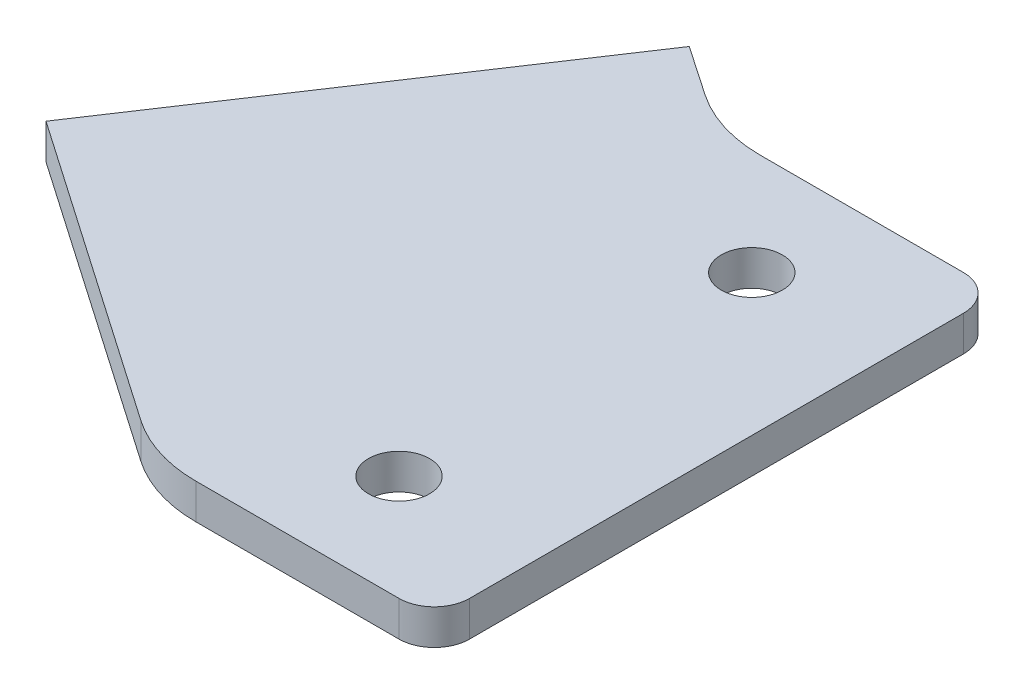
ISO-10303-21;
HEADER;
FILE_DESCRIPTION(('STEP AP214'),'2;1');
FILE_NAME('part.step','',(''),(''),'','','');
FILE_SCHEMA(('AUTOMOTIVE_DESIGN { 1 0 10303 214 1 1 1 1 }'));
ENDSEC;
DATA;
#1=APPLICATION_CONTEXT('core data for automotive mechanical design processes');
#2=APPLICATION_PROTOCOL_DEFINITION('international standard','automotive_design',2000,#1);
#3=PRODUCT_CONTEXT('',#1,'mechanical');
#4=PRODUCT('Part','Part','',(#3));
#5=PRODUCT_RELATED_PRODUCT_CATEGORY('part','',(#4));
#6=PRODUCT_DEFINITION_FORMATION('','',#4);
#7=PRODUCT_DEFINITION_CONTEXT('part definition',#1,'design');
#8=PRODUCT_DEFINITION('design','',#6,#7);
#9=PRODUCT_DEFINITION_SHAPE('','',#8);
#10=(LENGTH_UNIT() NAMED_UNIT(*) SI_UNIT(.MILLI.,.METRE.));
#11=(NAMED_UNIT(*) PLANE_ANGLE_UNIT() SI_UNIT($,.RADIAN.));
#12=(NAMED_UNIT(*) SI_UNIT($,.STERADIAN.) SOLID_ANGLE_UNIT());
#13=UNCERTAINTY_MEASURE_WITH_UNIT(LENGTH_MEASURE(1.E-05),#10,'distance_accuracy_value','');
#14=(GEOMETRIC_REPRESENTATION_CONTEXT(3) GLOBAL_UNCERTAINTY_ASSIGNED_CONTEXT((#13)) GLOBAL_UNIT_ASSIGNED_CONTEXT((#10,
#11,#12)) REPRESENTATION_CONTEXT('',''));
#15=CARTESIAN_POINT('',(0.,0.,0.));
#16=DIRECTION('',(0.,0.,1.));
#17=DIRECTION('',(1.,0.,0.));
#18=AXIS2_PLACEMENT_3D('',#15,#16,#17);
#19=CARTESIAN_POINT('',(7.79061264258719,3.175,-11.4133088590096));
#20=DIRECTION('',(-0.563772021262989,0.,0.82593044988125));
#21=DIRECTION('',(0.82593044988125,0.,0.563772021262989));
#22=AXIS2_PLACEMENT_3D('',#19,#20,#21);
#23=PLANE('',#22);
#24=DIRECTION('',(-0.82593044988125,0.,-0.563772021262989));
#25=VECTOR('',#24,1.);
#26=CARTESIAN_POINT('',(7.79061264258719,3.175,-11.4133088590096));
#27=LINE('',#26,#25);
#28=CARTESIAN_POINT('',(-15.9386684200472,3.175,-27.6106832865081));
#29=VERTEX_POINT('',#28);
#30=CARTESIAN_POINT('',(-20.4290441478931,3.175,-30.6757696998761));
#31=VERTEX_POINT('',#30);
#32=EDGE_CURVE('E123',#29,#31,#27,.T.);
#33=ORIENTED_EDGE('',*,*,#32,.F.);
#34=DIRECTION('',(0.,-1.,0.));
#35=VECTOR('',#34,1.);
#36=CARTESIAN_POINT('',(-15.9386684200472,3.175,-27.6106832865081));
#37=LINE('',#36,#35);
#38=CARTESIAN_POINT('',(-15.9386684200472,0.,-27.6106832865081));
#39=VERTEX_POINT('',#38);
#40=EDGE_CURVE('E172',#29,#39,#37,.T.);
#41=ORIENTED_EDGE('',*,*,#40,.T.);
#42=DIRECTION('',(-0.82593044988125,0.,-0.563772021262989));
#43=VECTOR('',#42,1.);
#44=CARTESIAN_POINT('',(7.79061264258719,0.,-11.4133088590096));
#45=LINE('',#44,#43);
#46=CARTESIAN_POINT('',(-20.4290441478931,0.,-30.6757696998761));
#47=VERTEX_POINT('',#46);
#48=EDGE_CURVE('E149',#39,#47,#45,.T.);
#49=ORIENTED_EDGE('',*,*,#48,.T.);
#50=DIRECTION('',(0.,-1.,0.));
#51=VECTOR('',#50,1.);
#52=CARTESIAN_POINT('',(-20.4290441478931,3.175,-30.6757696998761));
#53=LINE('',#52,#51);
#54=EDGE_CURVE('E142',#31,#47,#53,.T.);
#55=ORIENTED_EDGE('',*,*,#54,.F.);
#56=EDGE_LOOP('',(#33,#41,#49,#55));
#57=FACE_BOUND('',#56,.T.);
#58=ADVANCED_FACE('F42',(#57),#23,.F.);
#59=CARTESIAN_POINT('',(-28.3089273447949,3.175,-18.8278233541806));
#60=DIRECTION('',(0.832657900541182,0.,0.553787703607033));
#61=DIRECTION('',(0.553787703607033,0.,-0.832657900541182));
#62=AXIS2_PLACEMENT_3D('',#59,#60,#61);
#63=PLANE('',#62);
#64=DIRECTION('',(-0.553787703607033,0.,0.832657900541182));
#65=VECTOR('',#64,1.);
#66=CARTESIAN_POINT('',(-28.3089273447949,0.,-18.8278233541806));
#67=LINE('',#66,#65);
#68=CARTESIAN_POINT('',(-43.5522803888282,0.,4.0916063481795));
#69=VERTEX_POINT('',#68);
#70=EDGE_CURVE('E229',#47,#69,#67,.T.);
#71=ORIENTED_EDGE('',*,*,#70,.T.);
#72=DIRECTION('',(0.,-1.,0.));
#73=VECTOR('',#72,1.);
#74=CARTESIAN_POINT('',(-43.5522803888282,3.175,4.0916063481795));
#75=LINE('',#74,#73);
#76=CARTESIAN_POINT('',(-43.5522803888282,3.175,4.0916063481795));
#77=VERTEX_POINT('',#76);
#78=EDGE_CURVE('E144',#77,#69,#75,.T.);
#79=ORIENTED_EDGE('',*,*,#78,.F.);
#80=DIRECTION('',(-0.553787703607033,0.,0.832657900541182));
#81=VECTOR('',#80,1.);
#82=CARTESIAN_POINT('',(-28.3089273447949,3.175,-18.8278233541806));
#83=LINE('',#82,#81);
#84=EDGE_CURVE('E127',#31,#77,#83,.T.);
#85=ORIENTED_EDGE('',*,*,#84,.F.);
#86=ORIENTED_EDGE('',*,*,#54,.T.);
#87=EDGE_LOOP('',(#71,#79,#85,#86));
#88=FACE_BOUND('',#87,.T.);
#89=ADVANCED_FACE('F141',(#88),#63,.F.);
#90=CARTESIAN_POINT('',(-15.978739696436,3.175,23.1355101388614));
#91=DIRECTION('',(-0.568292364297039,0.,0.822826706349327));
#92=DIRECTION('',(0.822826706349327,0.,0.568292364297039));
#93=AXIS2_PLACEMENT_3D('',#90,#91,#92);
#94=PLANE('',#93);
#95=DIRECTION('',(-0.822826706349327,0.,-0.568292364297039));
#96=VECTOR('',#95,1.);
#97=CARTESIAN_POINT('',(-15.978739696436,0.,23.1355101388614));
#98=LINE('',#97,#96);
#99=CARTESIAN_POINT('',(-15.9579059137444,0.,23.1498991706365));
#100=VERTEX_POINT('',#99);
#101=EDGE_CURVE('E223',#100,#69,#98,.T.);
#102=ORIENTED_EDGE('',*,*,#101,.F.);
#103=DIRECTION('',(0.,-1.,0.));
#104=VECTOR('',#103,1.);
#105=CARTESIAN_POINT('',(-15.9579059137444,3.175,23.1498991706365));
#106=LINE('',#105,#104);
#107=CARTESIAN_POINT('',(-15.9579059137444,3.175,23.1498991706365));
#108=VERTEX_POINT('',#107);
#109=EDGE_CURVE('E166',#100,#108,#106,.F.);
#110=ORIENTED_EDGE('',*,*,#109,.T.);
#111=DIRECTION('',(-0.822826706349327,0.,-0.568292364297039));
#112=VECTOR('',#111,1.);
#113=CARTESIAN_POINT('',(-15.978739696436,3.175,23.1355101388614));
#114=LINE('',#113,#112);
#115=EDGE_CURVE('E146',#108,#77,#114,.T.);
#116=ORIENTED_EDGE('',*,*,#115,.T.);
#117=ORIENTED_EDGE('',*,*,#78,.T.);
#118=EDGE_LOOP('',(#102,#110,#116,#117));
#119=FACE_BOUND('',#118,.T.);
#120=ADVANCED_FACE('F294',(#119),#94,.T.);
#121=CARTESIAN_POINT('',(0.,3.175,25.4));
#122=DIRECTION('',(0.,0.,-1.));
#123=DIRECTION('',(-1.,0.,0.));
#124=AXIS2_PLACEMENT_3D('',#121,#122,#123);
#125=PLANE('',#124);
#126=DIRECTION('',(1.,0.,0.));
#127=VECTOR('',#126,1.);
#128=CARTESIAN_POINT('',(0.,0.,25.4));
#129=LINE('',#128,#127);
#130=CARTESIAN_POINT('',(-8.74059288717198,0.,25.4));
#131=VERTEX_POINT('',#130);
#132=CARTESIAN_POINT('',(9.525,0.,25.4));
#133=VERTEX_POINT('',#132);
#134=EDGE_CURVE('E218',#131,#133,#129,.T.);
#135=ORIENTED_EDGE('',*,*,#134,.T.);
#136=DIRECTION('',(0.,-1.,0.));
#137=VECTOR('',#136,1.);
#138=CARTESIAN_POINT('',(9.525,3.175,25.4));
#139=LINE('',#138,#137);
#140=CARTESIAN_POINT('',(9.525,3.175,25.4));
#141=VERTEX_POINT('',#140);
#142=EDGE_CURVE('E66',#133,#141,#139,.F.);
#143=ORIENTED_EDGE('',*,*,#142,.T.);
#144=DIRECTION('',(1.,0.,0.));
#145=VECTOR('',#144,1.);
#146=CARTESIAN_POINT('',(0.,3.175,25.4));
#147=LINE('',#146,#145);
#148=CARTESIAN_POINT('',(-8.74059288717198,3.175,25.4));
#149=VERTEX_POINT('',#148);
#150=EDGE_CURVE('E204',#149,#141,#147,.T.);
#151=ORIENTED_EDGE('',*,*,#150,.F.);
#152=DIRECTION('',(0.,-1.,0.));
#153=VECTOR('',#152,1.);
#154=CARTESIAN_POINT('',(-8.74059288717198,0.,25.4));
#155=LINE('',#154,#153);
#156=EDGE_CURVE('E152',#149,#131,#155,.T.);
#157=ORIENTED_EDGE('',*,*,#156,.T.);
#158=EDGE_LOOP('',(#135,#143,#151,#157));
#159=FACE_BOUND('',#158,.T.);
#160=ADVANCED_FACE('F220',(#159),#125,.F.);
#161=CARTESIAN_POINT('',(12.7,3.175,0.));
#162=DIRECTION('',(1.,0.,0.));
#163=DIRECTION('',(0.,0.,-1.));
#164=AXIS2_PLACEMENT_3D('',#161,#162,#163);
#165=PLANE('',#164);
#166=DIRECTION('',(0.,0.,1.));
#167=VECTOR('',#166,1.);
#168=CARTESIAN_POINT('',(12.7,3.175,0.));
#169=LINE('',#168,#167);
#170=CARTESIAN_POINT('',(12.7,3.175,-22.225));
#171=VERTEX_POINT('',#170);
#172=CARTESIAN_POINT('',(12.7,3.175,22.225));
#173=VERTEX_POINT('',#172);
#174=EDGE_CURVE('E203',#171,#173,#169,.T.);
#175=ORIENTED_EDGE('',*,*,#174,.T.);
#176=DIRECTION('',(0.,-1.,0.));
#177=VECTOR('',#176,1.);
#178=CARTESIAN_POINT('',(12.7,0.,22.225));
#179=LINE('',#178,#177);
#180=CARTESIAN_POINT('',(12.7,0.,22.225));
#181=VERTEX_POINT('',#180);
#182=EDGE_CURVE('E186',#173,#181,#179,.T.);
#183=ORIENTED_EDGE('',*,*,#182,.T.);
#184=DIRECTION('',(0.,0.,1.));
#185=VECTOR('',#184,1.);
#186=CARTESIAN_POINT('',(12.7,0.,0.));
#187=LINE('',#186,#185);
#188=CARTESIAN_POINT('',(12.7,0.,-22.225));
#189=VERTEX_POINT('',#188);
#190=EDGE_CURVE('E219',#189,#181,#187,.T.);
#191=ORIENTED_EDGE('',*,*,#190,.F.);
#192=DIRECTION('',(0.,-1.,0.));
#193=VECTOR('',#192,1.);
#194=CARTESIAN_POINT('',(12.7,3.175,-22.225));
#195=LINE('',#194,#193);
#196=EDGE_CURVE('E183',#189,#171,#195,.F.);
#197=ORIENTED_EDGE('',*,*,#196,.T.);
#198=EDGE_LOOP('',(#175,#183,#191,#197));
#199=FACE_BOUND('',#198,.T.);
#200=ADVANCED_FACE('F208',(#199),#165,.T.);
#201=CARTESIAN_POINT('',(0.,3.175,-25.4));
#202=DIRECTION('',(0.,0.,-1.));
#203=DIRECTION('',(-1.,0.,0.));
#204=AXIS2_PLACEMENT_3D('',#201,#202,#203);
#205=PLANE('',#204);
#206=DIRECTION('',(1.,0.,0.));
#207=VECTOR('',#206,1.);
#208=CARTESIAN_POINT('',(0.,3.175,-25.4));
#209=LINE('',#208,#207);
#210=CARTESIAN_POINT('',(-8.77876375000724,3.175,-25.4));
#211=VERTEX_POINT('',#210);
#212=CARTESIAN_POINT('',(9.525,3.175,-25.4));
#213=VERTEX_POINT('',#212);
#214=EDGE_CURVE('E160',#211,#213,#209,.T.);
#215=ORIENTED_EDGE('',*,*,#214,.T.);
#216=DIRECTION('',(0.,-1.,0.));
#217=VECTOR('',#216,1.);
#218=CARTESIAN_POINT('',(9.525,3.175,-25.4));
#219=LINE('',#218,#217);
#220=CARTESIAN_POINT('',(9.525,0.,-25.4));
#221=VERTEX_POINT('',#220);
#222=EDGE_CURVE('E11',#213,#221,#219,.T.);
#223=ORIENTED_EDGE('',*,*,#222,.T.);
#224=DIRECTION('',(1.,0.,0.));
#225=VECTOR('',#224,1.);
#226=CARTESIAN_POINT('',(0.,0.,-25.4));
#227=LINE('',#226,#225);
#228=CARTESIAN_POINT('',(-8.77876375000724,0.,-25.4));
#229=VERTEX_POINT('',#228);
#230=EDGE_CURVE('E136',#229,#221,#227,.T.);
#231=ORIENTED_EDGE('',*,*,#230,.F.);
#232=DIRECTION('',(0.,-1.,0.));
#233=VECTOR('',#232,1.);
#234=CARTESIAN_POINT('',(-8.77876375000724,3.175,-25.4));
#235=LINE('',#234,#233);
#236=EDGE_CURVE('E175',#229,#211,#235,.F.);
#237=ORIENTED_EDGE('',*,*,#236,.T.);
#238=EDGE_LOOP('',(#215,#223,#231,#237));
#239=FACE_BOUND('',#238,.T.);
#240=ADVANCED_FACE('F238',(#239),#205,.T.);
#241=CARTESIAN_POINT('',(0.,3.175,0.));
#242=DIRECTION('',(0.,1.,0.));
#243=DIRECTION('',(0.,0.,1.));
#244=AXIS2_PLACEMENT_3D('',#241,#242,#243);
#245=PLANE('',#244);
#246=CARTESIAN_POINT('',(0.,3.175,-15.875));
#247=DIRECTION('',(0.,1.,0.));
#248=DIRECTION('',(0.,0.,1.));
#249=AXIS2_PLACEMENT_3D('',#246,#247,#248);
#250=CIRCLE('',#249,2.75);
#251=CARTESIAN_POINT('',(0.,3.175,-13.125));
#252=VERTEX_POINT('',#251);
#253=EDGE_CURVE('E261',#252,#252,#250,.T.);
#254=ORIENTED_EDGE('',*,*,#253,.F.);
#255=EDGE_LOOP('',(#254));
#256=FACE_BOUND('',#255,.T.);
#257=CARTESIAN_POINT('',(0.,3.175,15.875));
#258=DIRECTION('',(0.,1.,0.));
#259=DIRECTION('',(0.,0.,1.));
#260=AXIS2_PLACEMENT_3D('',#257,#258,#259);
#261=CIRCLE('',#260,2.75);
#262=CARTESIAN_POINT('',(0.,3.175,18.625));
#263=VERTEX_POINT('',#262);
#264=EDGE_CURVE('E243',#263,#263,#261,.T.);
#265=ORIENTED_EDGE('',*,*,#264,.F.);
#266=EDGE_LOOP('',(#265));
#267=FACE_BOUND('',#266,.T.);
#268=ORIENTED_EDGE('',*,*,#150,.T.);
#269=CARTESIAN_POINT('',(9.525,3.175,22.225));
#270=DIRECTION('',(0.,1.,0.));
#271=DIRECTION('',(0.,0.,1.));
#272=AXIS2_PLACEMENT_3D('',#269,#270,#271);
#273=CIRCLE('',#272,3.175);
#274=EDGE_CURVE('E51',#141,#173,#273,.T.);
#275=ORIENTED_EDGE('',*,*,#274,.T.);
#276=ORIENTED_EDGE('',*,*,#174,.F.);
#277=CARTESIAN_POINT('',(9.525,3.175,-22.225));
#278=DIRECTION('',(0.,1.,0.));
#279=DIRECTION('',(0.,0.,1.));
#280=AXIS2_PLACEMENT_3D('',#277,#278,#279);
#281=CIRCLE('',#280,3.175);
#282=EDGE_CURVE('E58',#171,#213,#281,.T.);
#283=ORIENTED_EDGE('',*,*,#282,.T.);
#284=ORIENTED_EDGE('',*,*,#214,.F.);
#285=CARTESIAN_POINT('',(-8.77876375000724,3.175,-38.1));
#286=DIRECTION('',(0.,1.,0.));
#287=DIRECTION('',(0.,0.,1.));
#288=AXIS2_PLACEMENT_3D('',#285,#286,#287);
#289=CIRCLE('',#288,12.7);
#290=EDGE_CURVE('E130',#211,#29,#289,.F.);
#291=ORIENTED_EDGE('',*,*,#290,.T.);
#292=ORIENTED_EDGE('',*,*,#32,.T.);
#293=ORIENTED_EDGE('',*,*,#84,.T.);
#294=ORIENTED_EDGE('',*,*,#115,.F.);
#295=CARTESIAN_POINT('',(-8.74059288717198,3.175,12.7));
#296=DIRECTION('',(0.,1.,0.));
#297=DIRECTION('',(0.,0.,1.));
#298=AXIS2_PLACEMENT_3D('',#295,#296,#297);
#299=CIRCLE('',#298,12.7);
#300=EDGE_CURVE('E169',#108,#149,#299,.T.);
#301=ORIENTED_EDGE('',*,*,#300,.T.);
#302=EDGE_LOOP('',(#268,#275,#276,#283,#284,#291,#292,#293,#294,#301));
#303=FACE_BOUND('',#302,.T.);
#304=ADVANCED_FACE('F125',(#256,#267,#303),#245,.T.);
#305=CARTESIAN_POINT('',(0.,0.,0.));
#306=DIRECTION('',(0.,1.,0.));
#307=DIRECTION('',(0.,0.,1.));
#308=AXIS2_PLACEMENT_3D('',#305,#306,#307);
#309=PLANE('',#308);
#310=CARTESIAN_POINT('',(0.,0.,-15.875));
#311=DIRECTION('',(0.,-1.,0.));
#312=DIRECTION('',(0.,0.,-1.));
#313=AXIS2_PLACEMENT_3D('',#310,#311,#312);
#314=CIRCLE('',#313,2.75);
#315=CARTESIAN_POINT('',(0.,0.,-18.625));
#316=VERTEX_POINT('',#315);
#317=EDGE_CURVE('E265',#316,#316,#314,.T.);
#318=ORIENTED_EDGE('',*,*,#317,.F.);
#319=EDGE_LOOP('',(#318));
#320=FACE_BOUND('',#319,.T.);
#321=CARTESIAN_POINT('',(0.,0.,15.875));
#322=DIRECTION('',(0.,-1.,0.));
#323=DIRECTION('',(0.,0.,-1.));
#324=AXIS2_PLACEMENT_3D('',#321,#322,#323);
#325=CIRCLE('',#324,2.75);
#326=CARTESIAN_POINT('',(0.,0.,13.125));
#327=VERTEX_POINT('',#326);
#328=EDGE_CURVE('E249',#327,#327,#325,.T.);
#329=ORIENTED_EDGE('',*,*,#328,.F.);
#330=EDGE_LOOP('',(#329));
#331=FACE_BOUND('',#330,.T.);
#332=ORIENTED_EDGE('',*,*,#190,.T.);
#333=CARTESIAN_POINT('',(9.525,0.,22.225));
#334=DIRECTION('',(0.,1.,0.));
#335=DIRECTION('',(0.,0.,1.));
#336=AXIS2_PLACEMENT_3D('',#333,#334,#335);
#337=CIRCLE('',#336,3.175);
#338=EDGE_CURVE('E193',#181,#133,#337,.F.);
#339=ORIENTED_EDGE('',*,*,#338,.T.);
#340=ORIENTED_EDGE('',*,*,#134,.F.);
#341=CARTESIAN_POINT('',(-8.74059288717198,0.,12.7));
#342=DIRECTION('',(0.,1.,0.));
#343=DIRECTION('',(0.,0.,1.));
#344=AXIS2_PLACEMENT_3D('',#341,#342,#343);
#345=CIRCLE('',#344,12.7);
#346=EDGE_CURVE('E158',#131,#100,#345,.F.);
#347=ORIENTED_EDGE('',*,*,#346,.T.);
#348=ORIENTED_EDGE('',*,*,#101,.T.);
#349=ORIENTED_EDGE('',*,*,#70,.F.);
#350=ORIENTED_EDGE('',*,*,#48,.F.);
#351=CARTESIAN_POINT('',(-8.77876375000724,0.,-38.1));
#352=DIRECTION('',(0.,1.,0.));
#353=DIRECTION('',(0.,0.,1.));
#354=AXIS2_PLACEMENT_3D('',#351,#352,#353);
#355=CIRCLE('',#354,12.7);
#356=EDGE_CURVE('E178',#39,#229,#355,.T.);
#357=ORIENTED_EDGE('',*,*,#356,.T.);
#358=ORIENTED_EDGE('',*,*,#230,.T.);
#359=CARTESIAN_POINT('',(9.525,0.,-22.225));
#360=DIRECTION('',(0.,1.,0.));
#361=DIRECTION('',(0.,0.,1.));
#362=AXIS2_PLACEMENT_3D('',#359,#360,#361);
#363=CIRCLE('',#362,3.175);
#364=EDGE_CURVE('E190',#221,#189,#363,.F.);
#365=ORIENTED_EDGE('',*,*,#364,.T.);
#366=EDGE_LOOP('',(#332,#339,#340,#347,#348,#349,#350,#357,#358,#365));
#367=FACE_BOUND('',#366,.T.);
#368=ADVANCED_FACE('F217',(#320,#331,#367),#309,.F.);
#369=CARTESIAN_POINT('',(0.,0.,15.875));
#370=DIRECTION('',(0.,-1.,0.));
#371=DIRECTION('',(0.,0.,-1.));
#372=AXIS2_PLACEMENT_3D('',#369,#370,#371);
#373=CYLINDRICAL_SURFACE('',#372,2.75);
#374=ORIENTED_EDGE('',*,*,#264,.T.);
#375=EDGE_LOOP('',(#374));
#376=FACE_BOUND('',#375,.T.);
#377=ORIENTED_EDGE('',*,*,#328,.T.);
#378=EDGE_LOOP('',(#377));
#379=FACE_BOUND('',#378,.T.);
#380=ADVANCED_FACE('F275',(#376,#379),#373,.F.);
#381=CARTESIAN_POINT('',(0.,0.,-15.875));
#382=DIRECTION('',(0.,-1.,0.));
#383=DIRECTION('',(0.,0.,-1.));
#384=AXIS2_PLACEMENT_3D('',#381,#382,#383);
#385=CYLINDRICAL_SURFACE('',#384,2.75);
#386=ORIENTED_EDGE('',*,*,#253,.T.);
#387=EDGE_LOOP('',(#386));
#388=FACE_BOUND('',#387,.T.);
#389=ORIENTED_EDGE('',*,*,#317,.T.);
#390=EDGE_LOOP('',(#389));
#391=FACE_BOUND('',#390,.T.);
#392=ADVANCED_FACE('F271',(#388,#391),#385,.F.);
#393=CARTESIAN_POINT('',(-8.74059288717198,3.175,12.7));
#394=DIRECTION('',(0.,1.,0.));
#395=DIRECTION('',(0.,0.,1.));
#396=AXIS2_PLACEMENT_3D('',#393,#394,#395);
#397=CYLINDRICAL_SURFACE('',#396,12.7);
#398=ORIENTED_EDGE('',*,*,#300,.F.);
#399=ORIENTED_EDGE('',*,*,#109,.F.);
#400=ORIENTED_EDGE('',*,*,#346,.F.);
#401=ORIENTED_EDGE('',*,*,#156,.F.);
#402=EDGE_LOOP('',(#398,#399,#400,#401));
#403=FACE_BOUND('',#402,.T.);
#404=ADVANCED_FACE('F285',(#403),#397,.T.);
#405=CARTESIAN_POINT('',(-8.77876375000724,3.175,-38.1));
#406=DIRECTION('',(0.,-1.,0.));
#407=DIRECTION('',(0.,0.,-1.));
#408=AXIS2_PLACEMENT_3D('',#405,#406,#407);
#409=CYLINDRICAL_SURFACE('',#408,12.7);
#410=ORIENTED_EDGE('',*,*,#290,.F.);
#411=ORIENTED_EDGE('',*,*,#236,.F.);
#412=ORIENTED_EDGE('',*,*,#356,.F.);
#413=ORIENTED_EDGE('',*,*,#40,.F.);
#414=EDGE_LOOP('',(#410,#411,#412,#413));
#415=FACE_BOUND('',#414,.T.);
#416=ADVANCED_FACE('F241',(#415),#409,.F.);
#417=CARTESIAN_POINT('',(9.525,3.175,22.225));
#418=DIRECTION('',(0.,1.,0.));
#419=DIRECTION('',(0.,0.,1.));
#420=AXIS2_PLACEMENT_3D('',#417,#418,#419);
#421=CYLINDRICAL_SURFACE('',#420,3.175);
#422=ORIENTED_EDGE('',*,*,#274,.F.);
#423=ORIENTED_EDGE('',*,*,#142,.F.);
#424=ORIENTED_EDGE('',*,*,#338,.F.);
#425=ORIENTED_EDGE('',*,*,#182,.F.);
#426=EDGE_LOOP('',(#422,#423,#424,#425));
#427=FACE_BOUND('',#426,.T.);
#428=ADVANCED_FACE('F214',(#427),#421,.T.);
#429=CARTESIAN_POINT('',(9.525,3.175,-22.225));
#430=DIRECTION('',(0.,-1.,0.));
#431=DIRECTION('',(0.,0.,-1.));
#432=AXIS2_PLACEMENT_3D('',#429,#430,#431);
#433=CYLINDRICAL_SURFACE('',#432,3.175);
#434=ORIENTED_EDGE('',*,*,#282,.F.);
#435=ORIENTED_EDGE('',*,*,#196,.F.);
#436=ORIENTED_EDGE('',*,*,#364,.F.);
#437=ORIENTED_EDGE('',*,*,#222,.F.);
#438=EDGE_LOOP('',(#434,#435,#436,#437));
#439=FACE_BOUND('',#438,.T.);
#440=ADVANCED_FACE('F44',(#439),#433,.T.);
#441=CLOSED_SHELL('',(#58,#89,#120,#160,#200,#240,#304,#368,#380,#392,#404,#416,#428,#440));
#442=MANIFOLD_SOLID_BREP('B2',#441);
#443=ADVANCED_BREP_SHAPE_REPRESENTATION('',(#18,#442),#14);
#444=SHAPE_DEFINITION_REPRESENTATION(#9,#443);
ENDSEC;
END-ISO-10303-21;
